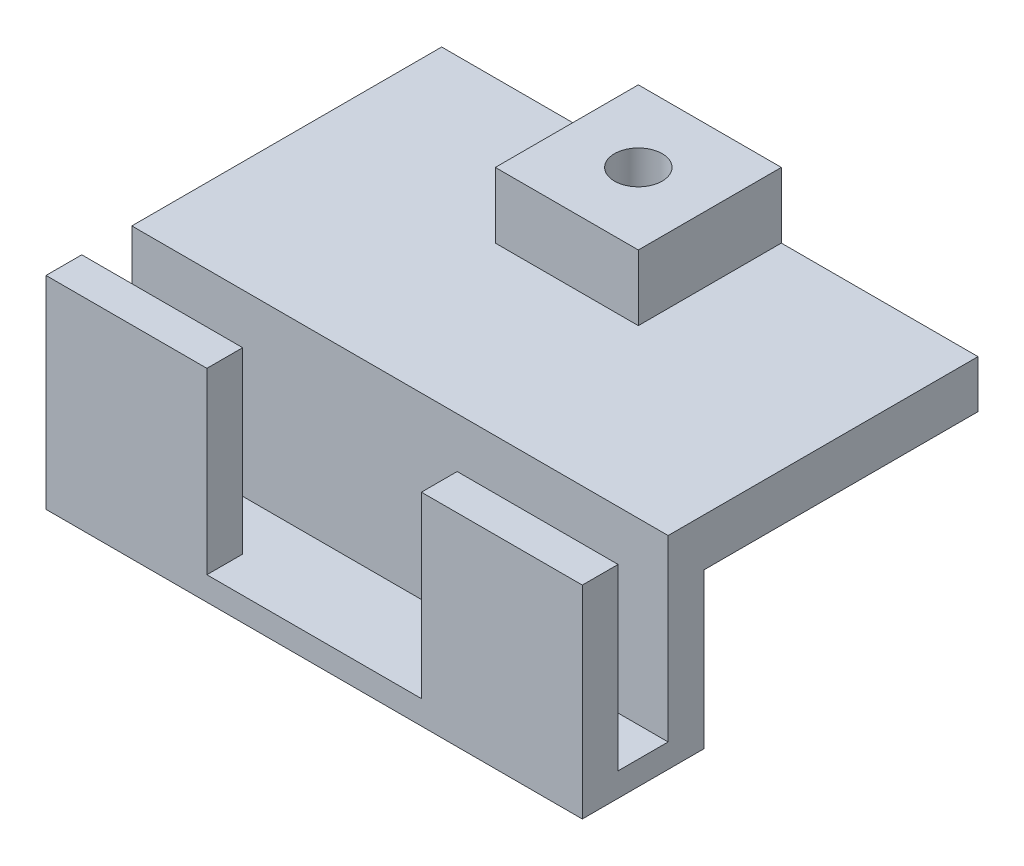
ISO-10303-21;
HEADER;
FILE_DESCRIPTION(('STEP AP214'),'2;1');
FILE_NAME('part.step','',(''),(''),'','','');
FILE_SCHEMA(('AUTOMOTIVE_DESIGN { 1 0 10303 214 1 1 1 1 }'));
ENDSEC;
DATA;
#1=APPLICATION_CONTEXT('core data for automotive mechanical design processes');
#2=APPLICATION_PROTOCOL_DEFINITION('international standard','automotive_design',2000,#1);
#3=PRODUCT_CONTEXT('',#1,'mechanical');
#4=PRODUCT('Part','Part','',(#3));
#5=PRODUCT_RELATED_PRODUCT_CATEGORY('part','',(#4));
#6=PRODUCT_DEFINITION_FORMATION('','',#4);
#7=PRODUCT_DEFINITION_CONTEXT('part definition',#1,'design');
#8=PRODUCT_DEFINITION('design','',#6,#7);
#9=PRODUCT_DEFINITION_SHAPE('','',#8);
#10=(LENGTH_UNIT() NAMED_UNIT(*) SI_UNIT(.MILLI.,.METRE.));
#11=(NAMED_UNIT(*) PLANE_ANGLE_UNIT() SI_UNIT($,.RADIAN.));
#12=(NAMED_UNIT(*) SI_UNIT($,.STERADIAN.) SOLID_ANGLE_UNIT());
#13=UNCERTAINTY_MEASURE_WITH_UNIT(LENGTH_MEASURE(1.E-05),#10,'distance_accuracy_value','');
#14=(GEOMETRIC_REPRESENTATION_CONTEXT(3) GLOBAL_UNCERTAINTY_ASSIGNED_CONTEXT((#13)) GLOBAL_UNIT_ASSIGNED_CONTEXT((#10,
#11,#12)) REPRESENTATION_CONTEXT('',''));
#15=CARTESIAN_POINT('',(0.,0.,0.));
#16=DIRECTION('',(0.,0.,1.));
#17=DIRECTION('',(1.,0.,0.));
#18=AXIS2_PLACEMENT_3D('',#15,#16,#17);
#19=CARTESIAN_POINT('',(0.,17.,0.));
#20=DIRECTION('',(0.,1.,0.));
#21=DIRECTION('',(0.,0.,1.));
#22=AXIS2_PLACEMENT_3D('',#19,#20,#21);
#23=PLANE('',#22);
#24=DIRECTION('',(1.,0.,0.));
#25=VECTOR('',#24,1.);
#26=CARTESIAN_POINT('',(22.5,17.,-28.1));
#27=LINE('',#26,#25);
#28=CARTESIAN_POINT('',(6.00000000000001,17.,-28.1));
#29=VERTEX_POINT('',#28);
#30=CARTESIAN_POINT('',(22.5,17.,-28.1));
#31=VERTEX_POINT('',#30);
#32=EDGE_CURVE('E200',#29,#31,#27,.T.);
#33=ORIENTED_EDGE('',*,*,#32,.F.);
#34=DIRECTION('',(0.,0.,-1.));
#35=VECTOR('',#34,1.);
#36=CARTESIAN_POINT('',(6.,17.,-16.1));
#37=LINE('',#36,#35);
#38=CARTESIAN_POINT('',(6.,17.,-16.1));
#39=VERTEX_POINT('',#38);
#40=EDGE_CURVE('E54',#39,#29,#37,.T.);
#41=ORIENTED_EDGE('',*,*,#40,.F.);
#42=DIRECTION('',(1.,0.,0.));
#43=VECTOR('',#42,1.);
#44=CARTESIAN_POINT('',(-6.,17.,-16.1));
#45=LINE('',#44,#43);
#46=CARTESIAN_POINT('',(-6.,17.,-16.1));
#47=VERTEX_POINT('',#46);
#48=EDGE_CURVE('E183',#47,#39,#45,.T.);
#49=ORIENTED_EDGE('',*,*,#48,.F.);
#50=DIRECTION('',(0.,0.,1.));
#51=VECTOR('',#50,1.);
#52=CARTESIAN_POINT('',(-6.,17.,-16.1));
#53=LINE('',#52,#51);
#54=CARTESIAN_POINT('',(-6.,17.,-28.1));
#55=VERTEX_POINT('',#54);
#56=EDGE_CURVE('E569',#55,#47,#53,.T.);
#57=ORIENTED_EDGE('',*,*,#56,.F.);
#58=CARTESIAN_POINT('',(-22.5,17.,-28.1));
#59=VERTEX_POINT('',#58);
#60=EDGE_CURVE('E201',#59,#55,#27,.T.);
#61=ORIENTED_EDGE('',*,*,#60,.F.);
#62=DIRECTION('',(0.,0.,1.));
#63=VECTOR('',#62,1.);
#64=CARTESIAN_POINT('',(-22.5,17.,-5.1));
#65=LINE('',#64,#63);
#66=CARTESIAN_POINT('',(-22.5,17.,-2.1));
#67=VERTEX_POINT('',#66);
#68=EDGE_CURVE('E210',#59,#67,#65,.T.);
#69=ORIENTED_EDGE('',*,*,#68,.T.);
#70=DIRECTION('',(1.,0.,0.));
#71=VECTOR('',#70,1.);
#72=CARTESIAN_POINT('',(-22.5,17.,-2.1));
#73=LINE('',#72,#71);
#74=CARTESIAN_POINT('',(22.5,17.,-2.1));
#75=VERTEX_POINT('',#74);
#76=EDGE_CURVE('E213',#67,#75,#73,.T.);
#77=ORIENTED_EDGE('',*,*,#76,.T.);
#78=DIRECTION('',(0.,0.,-1.));
#79=VECTOR('',#78,1.);
#80=CARTESIAN_POINT('',(22.5,17.,-5.1));
#81=LINE('',#80,#79);
#82=EDGE_CURVE('E216',#75,#31,#81,.T.);
#83=ORIENTED_EDGE('',*,*,#82,.T.);
#84=EDGE_LOOP('',(#33,#41,#49,#57,#61,#69,#77,#83));
#85=FACE_BOUND('',#84,.T.);
#86=ADVANCED_FACE('F39',(#85),#23,.T.);
#87=CARTESIAN_POINT('',(0.,2.,0.));
#88=DIRECTION('',(0.,-1.,0.));
#89=DIRECTION('',(0.,0.,-1.));
#90=AXIS2_PLACEMENT_3D('',#87,#88,#89);
#91=PLANE('',#90);
#92=DIRECTION('',(1.,0.,0.));
#93=VECTOR('',#92,1.);
#94=CARTESIAN_POINT('',(-22.5,2.,-2.1));
#95=LINE('',#94,#93);
#96=CARTESIAN_POINT('',(-22.5,2.,-2.1));
#97=VERTEX_POINT('',#96);
#98=CARTESIAN_POINT('',(22.5,2.,-2.1));
#99=VERTEX_POINT('',#98);
#100=EDGE_CURVE('E209',#97,#99,#95,.T.);
#101=ORIENTED_EDGE('',*,*,#100,.F.);
#102=DIRECTION('',(0.,0.,1.));
#103=VECTOR('',#102,1.);
#104=CARTESIAN_POINT('',(-22.5,2.,-5.1));
#105=LINE('',#104,#103);
#106=CARTESIAN_POINT('',(-22.5,2.,2.1));
#107=VERTEX_POINT('',#106);
#108=EDGE_CURVE('E285',#97,#107,#105,.T.);
#109=ORIENTED_EDGE('',*,*,#108,.T.);
#110=DIRECTION('',(-1.,0.,0.));
#111=VECTOR('',#110,1.);
#112=CARTESIAN_POINT('',(-22.5,2.,2.1));
#113=LINE('',#112,#111);
#114=CARTESIAN_POINT('',(-9.,2.,2.1));
#115=VERTEX_POINT('',#114);
#116=EDGE_CURVE('E259',#115,#107,#113,.T.);
#117=ORIENTED_EDGE('',*,*,#116,.F.);
#118=DIRECTION('',(0.,0.,-1.));
#119=VECTOR('',#118,1.);
#120=CARTESIAN_POINT('',(-9.,2.,5.1));
#121=LINE('',#120,#119);
#122=CARTESIAN_POINT('',(-9.,2.,5.1));
#123=VERTEX_POINT('',#122);
#124=EDGE_CURVE('E254',#123,#115,#121,.T.);
#125=ORIENTED_EDGE('',*,*,#124,.F.);
#126=DIRECTION('',(1.,0.,0.));
#127=VECTOR('',#126,1.);
#128=CARTESIAN_POINT('',(-22.5,2.,5.1));
#129=LINE('',#128,#127);
#130=CARTESIAN_POINT('',(9.,2.,5.1));
#131=VERTEX_POINT('',#130);
#132=EDGE_CURVE('E279',#123,#131,#129,.T.);
#133=ORIENTED_EDGE('',*,*,#132,.T.);
#134=DIRECTION('',(0.,0.,1.));
#135=VECTOR('',#134,1.);
#136=CARTESIAN_POINT('',(9.,2.,5.1));
#137=LINE('',#136,#135);
#138=CARTESIAN_POINT('',(9.,2.,2.1));
#139=VERTEX_POINT('',#138);
#140=EDGE_CURVE('E232',#139,#131,#137,.T.);
#141=ORIENTED_EDGE('',*,*,#140,.F.);
#142=DIRECTION('',(-1.,0.,0.));
#143=VECTOR('',#142,1.);
#144=CARTESIAN_POINT('',(22.5,2.,2.1));
#145=LINE('',#144,#143);
#146=CARTESIAN_POINT('',(22.5,2.,2.1));
#147=VERTEX_POINT('',#146);
#148=EDGE_CURVE('E227',#147,#139,#145,.T.);
#149=ORIENTED_EDGE('',*,*,#148,.F.);
#150=DIRECTION('',(0.,0.,1.));
#151=VECTOR('',#150,1.);
#152=CARTESIAN_POINT('',(22.5,2.,-5.1));
#153=LINE('',#152,#151);
#154=EDGE_CURVE('E282',#99,#147,#153,.T.);
#155=ORIENTED_EDGE('',*,*,#154,.F.);
#156=EDGE_LOOP('',(#101,#109,#117,#125,#133,#141,#149,#155));
#157=FACE_BOUND('',#156,.T.);
#158=ADVANCED_FACE('F329',(#157),#91,.F.);
#159=CARTESIAN_POINT('',(-22.5,2.,5.1));
#160=DIRECTION('',(0.,0.,-1.));
#161=DIRECTION('',(-1.,0.,0.));
#162=AXIS2_PLACEMENT_3D('',#159,#160,#161);
#163=PLANE('',#162);
#164=DIRECTION('',(1.,0.,0.));
#165=VECTOR('',#164,1.);
#166=CARTESIAN_POINT('',(-22.5,0.,5.1));
#167=LINE('',#166,#165);
#168=CARTESIAN_POINT('',(-22.5,0.,5.1));
#169=VERTEX_POINT('',#168);
#170=CARTESIAN_POINT('',(22.5,0.,5.1));
#171=VERTEX_POINT('',#170);
#172=EDGE_CURVE('E278',#169,#171,#167,.T.);
#173=ORIENTED_EDGE('',*,*,#172,.T.);
#174=DIRECTION('',(0.,-1.,0.));
#175=VECTOR('',#174,1.);
#176=CARTESIAN_POINT('',(22.5,2.,5.1));
#177=LINE('',#176,#175);
#178=CARTESIAN_POINT('',(22.5,17.,5.1));
#179=VERTEX_POINT('',#178);
#180=EDGE_CURVE('E11',#179,#171,#177,.T.);
#181=ORIENTED_EDGE('',*,*,#180,.F.);
#182=DIRECTION('',(1.,0.,0.));
#183=VECTOR('',#182,1.);
#184=CARTESIAN_POINT('',(22.5,17.,5.1));
#185=LINE('',#184,#183);
#186=CARTESIAN_POINT('',(9.,17.,5.1));
#187=VERTEX_POINT('',#186);
#188=EDGE_CURVE('E237',#187,#179,#185,.T.);
#189=ORIENTED_EDGE('',*,*,#188,.F.);
#190=DIRECTION('',(0.,-1.,0.));
#191=VECTOR('',#190,1.);
#192=CARTESIAN_POINT('',(9.,17.,5.1));
#193=LINE('',#192,#191);
#194=EDGE_CURVE('E241',#187,#131,#193,.T.);
#195=ORIENTED_EDGE('',*,*,#194,.T.);
#196=ORIENTED_EDGE('',*,*,#132,.F.);
#197=DIRECTION('',(0.,-1.,0.));
#198=VECTOR('',#197,1.);
#199=CARTESIAN_POINT('',(-9.,17.,5.1));
#200=LINE('',#199,#198);
#201=CARTESIAN_POINT('',(-9.,17.,5.1));
#202=VERTEX_POINT('',#201);
#203=EDGE_CURVE('E275',#202,#123,#200,.T.);
#204=ORIENTED_EDGE('',*,*,#203,.F.);
#205=DIRECTION('',(1.,0.,0.));
#206=VECTOR('',#205,1.);
#207=CARTESIAN_POINT('',(-22.5,17.,5.1));
#208=LINE('',#207,#206);
#209=CARTESIAN_POINT('',(-22.5,17.,5.1));
#210=VERTEX_POINT('',#209);
#211=EDGE_CURVE('E258',#210,#202,#208,.T.);
#212=ORIENTED_EDGE('',*,*,#211,.F.);
#213=DIRECTION('',(0.,-1.,0.));
#214=VECTOR('',#213,1.);
#215=CARTESIAN_POINT('',(-22.5,2.,5.1));
#216=LINE('',#215,#214);
#217=EDGE_CURVE('E287',#210,#169,#216,.T.);
#218=ORIENTED_EDGE('',*,*,#217,.T.);
#219=EDGE_LOOP('',(#173,#181,#189,#195,#196,#204,#212,#218));
#220=FACE_BOUND('',#219,.T.);
#221=ADVANCED_FACE('F41',(#220),#163,.F.);
#222=CARTESIAN_POINT('',(22.5,2.,-5.1));
#223=DIRECTION('',(1.,0.,0.));
#224=DIRECTION('',(0.,0.,-1.));
#225=AXIS2_PLACEMENT_3D('',#222,#223,#224);
#226=PLANE('',#225);
#227=DIRECTION('',(0.,0.,1.));
#228=VECTOR('',#227,1.);
#229=CARTESIAN_POINT('',(22.5,0.,-5.1));
#230=LINE('',#229,#228);
#231=CARTESIAN_POINT('',(22.5,0.,-5.1));
#232=VERTEX_POINT('',#231);
#233=EDGE_CURVE('E290',#232,#171,#230,.T.);
#234=ORIENTED_EDGE('',*,*,#233,.F.);
#235=DIRECTION('',(0.,-1.,0.));
#236=VECTOR('',#235,1.);
#237=CARTESIAN_POINT('',(22.5,2.,-5.1));
#238=LINE('',#237,#236);
#239=CARTESIAN_POINT('',(22.5,13.,-5.1));
#240=VERTEX_POINT('',#239);
#241=EDGE_CURVE('E47',#240,#232,#238,.T.);
#242=ORIENTED_EDGE('',*,*,#241,.F.);
#243=DIRECTION('',(0.,0.,1.));
#244=VECTOR('',#243,1.);
#245=CARTESIAN_POINT('',(22.5,13.,-28.1));
#246=LINE('',#245,#244);
#247=CARTESIAN_POINT('',(22.5,13.,-28.1));
#248=VERTEX_POINT('',#247);
#249=EDGE_CURVE('E206',#248,#240,#246,.T.);
#250=ORIENTED_EDGE('',*,*,#249,.F.);
#251=DIRECTION('',(0.,-1.,0.));
#252=VECTOR('',#251,1.);
#253=CARTESIAN_POINT('',(22.5,17.,-28.1));
#254=LINE('',#253,#252);
#255=EDGE_CURVE('E188',#31,#248,#254,.T.);
#256=ORIENTED_EDGE('',*,*,#255,.F.);
#257=ORIENTED_EDGE('',*,*,#82,.F.);
#258=DIRECTION('',(0.,-1.,0.));
#259=VECTOR('',#258,1.);
#260=CARTESIAN_POINT('',(22.5,17.,-2.1));
#261=LINE('',#260,#259);
#262=EDGE_CURVE('E219',#75,#99,#261,.T.);
#263=ORIENTED_EDGE('',*,*,#262,.T.);
#264=ORIENTED_EDGE('',*,*,#154,.T.);
#265=DIRECTION('',(0.,-1.,0.));
#266=VECTOR('',#265,1.);
#267=CARTESIAN_POINT('',(22.5,17.,2.1));
#268=LINE('',#267,#266);
#269=CARTESIAN_POINT('',(22.5,17.,2.1));
#270=VERTEX_POINT('',#269);
#271=EDGE_CURVE('E251',#270,#147,#268,.T.);
#272=ORIENTED_EDGE('',*,*,#271,.F.);
#273=DIRECTION('',(0.,0.,-1.));
#274=VECTOR('',#273,1.);
#275=CARTESIAN_POINT('',(22.5,17.,5.1));
#276=LINE('',#275,#274);
#277=EDGE_CURVE('E228',#179,#270,#276,.T.);
#278=ORIENTED_EDGE('',*,*,#277,.F.);
#279=ORIENTED_EDGE('',*,*,#180,.T.);
#280=EDGE_LOOP('',(#234,#242,#250,#256,#257,#263,#264,#272,#278,#279));
#281=FACE_BOUND('',#280,.T.);
#282=ADVANCED_FACE('F305',(#281),#226,.T.);
#283=CARTESIAN_POINT('',(-22.5,2.,-5.1));
#284=DIRECTION('',(0.,0.,-1.));
#285=DIRECTION('',(-1.,0.,0.));
#286=AXIS2_PLACEMENT_3D('',#283,#284,#285);
#287=PLANE('',#286);
#288=DIRECTION('',(-1.,0.,0.));
#289=VECTOR('',#288,1.);
#290=CARTESIAN_POINT('',(22.5,13.,-5.1));
#291=LINE('',#290,#289);
#292=CARTESIAN_POINT('',(-22.5,13.,-5.1));
#293=VERTEX_POINT('',#292);
#294=EDGE_CURVE('E62',#240,#293,#291,.T.);
#295=ORIENTED_EDGE('',*,*,#294,.F.);
#296=ORIENTED_EDGE('',*,*,#241,.T.);
#297=DIRECTION('',(1.,0.,0.));
#298=VECTOR('',#297,1.);
#299=CARTESIAN_POINT('',(-22.5,0.,-5.1));
#300=LINE('',#299,#298);
#301=CARTESIAN_POINT('',(-22.5,0.,-5.1));
#302=VERTEX_POINT('',#301);
#303=EDGE_CURVE('E293',#302,#232,#300,.T.);
#304=ORIENTED_EDGE('',*,*,#303,.F.);
#305=DIRECTION('',(0.,-1.,0.));
#306=VECTOR('',#305,1.);
#307=CARTESIAN_POINT('',(-22.5,2.,-5.1));
#308=LINE('',#307,#306);
#309=EDGE_CURVE('E299',#293,#302,#308,.T.);
#310=ORIENTED_EDGE('',*,*,#309,.F.);
#311=EDGE_LOOP('',(#295,#296,#304,#310));
#312=FACE_BOUND('',#311,.T.);
#313=ADVANCED_FACE('F302',(#312),#287,.T.);
#314=CARTESIAN_POINT('',(-22.5,2.,-5.1));
#315=DIRECTION('',(1.,0.,0.));
#316=DIRECTION('',(0.,0.,-1.));
#317=AXIS2_PLACEMENT_3D('',#314,#315,#316);
#318=PLANE('',#317);
#319=DIRECTION('',(0.,0.,1.));
#320=VECTOR('',#319,1.);
#321=CARTESIAN_POINT('',(-22.5,0.,-5.1));
#322=LINE('',#321,#320);
#323=EDGE_CURVE('E283',#302,#169,#322,.T.);
#324=ORIENTED_EDGE('',*,*,#323,.T.);
#325=ORIENTED_EDGE('',*,*,#217,.F.);
#326=DIRECTION('',(0.,0.,1.));
#327=VECTOR('',#326,1.);
#328=CARTESIAN_POINT('',(-22.5,17.,5.1));
#329=LINE('',#328,#327);
#330=CARTESIAN_POINT('',(-22.5,17.,2.1));
#331=VERTEX_POINT('',#330);
#332=EDGE_CURVE('E255',#331,#210,#329,.T.);
#333=ORIENTED_EDGE('',*,*,#332,.F.);
#334=DIRECTION('',(0.,-1.,0.));
#335=VECTOR('',#334,1.);
#336=CARTESIAN_POINT('',(-22.5,17.,2.1));
#337=LINE('',#336,#335);
#338=EDGE_CURVE('E265',#331,#107,#337,.T.);
#339=ORIENTED_EDGE('',*,*,#338,.T.);
#340=ORIENTED_EDGE('',*,*,#108,.F.);
#341=DIRECTION('',(0.,-1.,0.));
#342=VECTOR('',#341,1.);
#343=CARTESIAN_POINT('',(-22.5,17.,-2.1));
#344=LINE('',#343,#342);
#345=EDGE_CURVE('E224',#67,#97,#344,.T.);
#346=ORIENTED_EDGE('',*,*,#345,.F.);
#347=ORIENTED_EDGE('',*,*,#68,.F.);
#348=DIRECTION('',(0.,1.,0.));
#349=VECTOR('',#348,1.);
#350=CARTESIAN_POINT('',(-22.5,17.,-28.1));
#351=LINE('',#350,#349);
#352=CARTESIAN_POINT('',(-22.5,13.,-28.1));
#353=VERTEX_POINT('',#352);
#354=EDGE_CURVE('E197',#353,#59,#351,.T.);
#355=ORIENTED_EDGE('',*,*,#354,.F.);
#356=DIRECTION('',(0.,0.,1.));
#357=VECTOR('',#356,1.);
#358=CARTESIAN_POINT('',(-22.5,13.,-28.1));
#359=LINE('',#358,#357);
#360=EDGE_CURVE('E202',#353,#293,#359,.T.);
#361=ORIENTED_EDGE('',*,*,#360,.T.);
#362=ORIENTED_EDGE('',*,*,#309,.T.);
#363=EDGE_LOOP('',(#324,#325,#333,#339,#340,#346,#347,#355,#361,#362));
#364=FACE_BOUND('',#363,.T.);
#365=ADVANCED_FACE('F312',(#364),#318,.F.);
#366=CARTESIAN_POINT('',(0.,0.,0.));
#367=DIRECTION('',(0.,-1.,0.));
#368=DIRECTION('',(0.,0.,-1.));
#369=AXIS2_PLACEMENT_3D('',#366,#367,#368);
#370=PLANE('',#369);
#371=ORIENTED_EDGE('',*,*,#172,.F.);
#372=ORIENTED_EDGE('',*,*,#323,.F.);
#373=ORIENTED_EDGE('',*,*,#303,.T.);
#374=ORIENTED_EDGE('',*,*,#233,.T.);
#375=EDGE_LOOP('',(#371,#372,#373,#374));
#376=FACE_BOUND('',#375,.T.);
#377=ADVANCED_FACE('F310',(#376),#370,.T.);
#378=CARTESIAN_POINT('',(-9.,17.,5.1));
#379=DIRECTION('',(-1.,0.,0.));
#380=DIRECTION('',(0.,0.,1.));
#381=AXIS2_PLACEMENT_3D('',#378,#379,#380);
#382=PLANE('',#381);
#383=ORIENTED_EDGE('',*,*,#124,.T.);
#384=DIRECTION('',(0.,-1.,0.));
#385=VECTOR('',#384,1.);
#386=CARTESIAN_POINT('',(-9.,17.,2.1));
#387=LINE('',#386,#385);
#388=CARTESIAN_POINT('',(-9.,17.,2.1));
#389=VERTEX_POINT('',#388);
#390=EDGE_CURVE('E272',#389,#115,#387,.T.);
#391=ORIENTED_EDGE('',*,*,#390,.F.);
#392=DIRECTION('',(0.,0.,-1.));
#393=VECTOR('',#392,1.);
#394=CARTESIAN_POINT('',(-9.,17.,5.1));
#395=LINE('',#394,#393);
#396=EDGE_CURVE('E261',#202,#389,#395,.T.);
#397=ORIENTED_EDGE('',*,*,#396,.F.);
#398=ORIENTED_EDGE('',*,*,#203,.T.);
#399=EDGE_LOOP('',(#383,#391,#397,#398));
#400=FACE_BOUND('',#399,.T.);
#401=ADVANCED_FACE('F331',(#400),#382,.F.);
#402=CARTESIAN_POINT('',(-22.5,17.,2.1));
#403=DIRECTION('',(0.,0.,1.));
#404=DIRECTION('',(1.,0.,0.));
#405=AXIS2_PLACEMENT_3D('',#402,#403,#404);
#406=PLANE('',#405);
#407=ORIENTED_EDGE('',*,*,#116,.T.);
#408=ORIENTED_EDGE('',*,*,#338,.F.);
#409=DIRECTION('',(-1.,0.,0.));
#410=VECTOR('',#409,1.);
#411=CARTESIAN_POINT('',(-22.5,17.,2.1));
#412=LINE('',#411,#410);
#413=EDGE_CURVE('E263',#389,#331,#412,.T.);
#414=ORIENTED_EDGE('',*,*,#413,.F.);
#415=ORIENTED_EDGE('',*,*,#390,.T.);
#416=EDGE_LOOP('',(#407,#408,#414,#415));
#417=FACE_BOUND('',#416,.T.);
#418=ADVANCED_FACE('F326',(#417),#406,.F.);
#419=CARTESIAN_POINT('',(0.,17.,0.));
#420=DIRECTION('',(0.,-1.,0.));
#421=DIRECTION('',(0.,0.,-1.));
#422=AXIS2_PLACEMENT_3D('',#419,#420,#421);
#423=PLANE('',#422);
#424=ORIENTED_EDGE('',*,*,#332,.T.);
#425=ORIENTED_EDGE('',*,*,#211,.T.);
#426=ORIENTED_EDGE('',*,*,#396,.T.);
#427=ORIENTED_EDGE('',*,*,#413,.T.);
#428=EDGE_LOOP('',(#424,#425,#426,#427));
#429=FACE_BOUND('',#428,.T.);
#430=ADVANCED_FACE('F320',(#429),#423,.F.);
#431=CARTESIAN_POINT('',(22.5,17.,2.1));
#432=DIRECTION('',(0.,0.,1.));
#433=DIRECTION('',(1.,0.,0.));
#434=AXIS2_PLACEMENT_3D('',#431,#432,#433);
#435=PLANE('',#434);
#436=ORIENTED_EDGE('',*,*,#148,.T.);
#437=DIRECTION('',(0.,-1.,0.));
#438=VECTOR('',#437,1.);
#439=CARTESIAN_POINT('',(9.,17.,2.1));
#440=LINE('',#439,#438);
#441=CARTESIAN_POINT('',(9.,17.,2.1));
#442=VERTEX_POINT('',#441);
#443=EDGE_CURVE('E247',#442,#139,#440,.T.);
#444=ORIENTED_EDGE('',*,*,#443,.F.);
#445=DIRECTION('',(-1.,0.,0.));
#446=VECTOR('',#445,1.);
#447=CARTESIAN_POINT('',(22.5,17.,2.1));
#448=LINE('',#447,#446);
#449=EDGE_CURVE('E231',#270,#442,#448,.T.);
#450=ORIENTED_EDGE('',*,*,#449,.F.);
#451=ORIENTED_EDGE('',*,*,#271,.T.);
#452=EDGE_LOOP('',(#436,#444,#450,#451));
#453=FACE_BOUND('',#452,.T.);
#454=ADVANCED_FACE('F362',(#453),#435,.F.);
#455=CARTESIAN_POINT('',(9.,17.,5.1));
#456=DIRECTION('',(1.,0.,0.));
#457=DIRECTION('',(0.,0.,-1.));
#458=AXIS2_PLACEMENT_3D('',#455,#456,#457);
#459=PLANE('',#458);
#460=ORIENTED_EDGE('',*,*,#140,.T.);
#461=ORIENTED_EDGE('',*,*,#194,.F.);
#462=DIRECTION('',(0.,0.,1.));
#463=VECTOR('',#462,1.);
#464=CARTESIAN_POINT('',(9.,17.,5.1));
#465=LINE('',#464,#463);
#466=EDGE_CURVE('E234',#442,#187,#465,.T.);
#467=ORIENTED_EDGE('',*,*,#466,.F.);
#468=ORIENTED_EDGE('',*,*,#443,.T.);
#469=EDGE_LOOP('',(#460,#461,#467,#468));
#470=FACE_BOUND('',#469,.T.);
#471=ADVANCED_FACE('F358',(#470),#459,.F.);
#472=CARTESIAN_POINT('',(0.,17.,0.));
#473=DIRECTION('',(0.,1.,0.));
#474=DIRECTION('',(0.,0.,1.));
#475=AXIS2_PLACEMENT_3D('',#472,#473,#474);
#476=PLANE('',#475);
#477=ORIENTED_EDGE('',*,*,#277,.T.);
#478=ORIENTED_EDGE('',*,*,#449,.T.);
#479=ORIENTED_EDGE('',*,*,#466,.T.);
#480=ORIENTED_EDGE('',*,*,#188,.T.);
#481=EDGE_LOOP('',(#477,#478,#479,#480));
#482=FACE_BOUND('',#481,.T.);
#483=ADVANCED_FACE('F354',(#482),#476,.T.);
#484=CARTESIAN_POINT('',(-22.5,17.,-2.1));
#485=DIRECTION('',(0.,0.,-1.));
#486=DIRECTION('',(-1.,0.,0.));
#487=AXIS2_PLACEMENT_3D('',#484,#485,#486);
#488=PLANE('',#487);
#489=ORIENTED_EDGE('',*,*,#100,.T.);
#490=ORIENTED_EDGE('',*,*,#262,.F.);
#491=ORIENTED_EDGE('',*,*,#76,.F.);
#492=ORIENTED_EDGE('',*,*,#345,.T.);
#493=EDGE_LOOP('',(#489,#490,#491,#492));
#494=FACE_BOUND('',#493,.T.);
#495=ADVANCED_FACE('F351',(#494),#488,.F.);
#496=CARTESIAN_POINT('',(22.5,13.,-28.1));
#497=DIRECTION('',(0.,1.,0.));
#498=DIRECTION('',(0.,0.,1.));
#499=AXIS2_PLACEMENT_3D('',#496,#497,#498);
#500=PLANE('',#499);
#501=ORIENTED_EDGE('',*,*,#294,.T.);
#502=ORIENTED_EDGE('',*,*,#360,.F.);
#503=DIRECTION('',(-1.,0.,0.));
#504=VECTOR('',#503,1.);
#505=CARTESIAN_POINT('',(22.5,13.,-28.1));
#506=LINE('',#505,#504);
#507=EDGE_CURVE('E195',#248,#353,#506,.T.);
#508=ORIENTED_EDGE('',*,*,#507,.F.);
#509=ORIENTED_EDGE('',*,*,#249,.T.);
#510=EDGE_LOOP('',(#501,#502,#508,#509));
#511=FACE_BOUND('',#510,.T.);
#512=ADVANCED_FACE('F349',(#511),#500,.F.);
#513=CARTESIAN_POINT('',(0.,0.,-28.1));
#514=DIRECTION('',(0.,0.,-1.));
#515=DIRECTION('',(-1.,0.,0.));
#516=AXIS2_PLACEMENT_3D('',#513,#514,#515);
#517=PLANE('',#516);
#518=ORIENTED_EDGE('',*,*,#255,.T.);
#519=ORIENTED_EDGE('',*,*,#507,.T.);
#520=ORIENTED_EDGE('',*,*,#354,.T.);
#521=ORIENTED_EDGE('',*,*,#60,.T.);
#522=DIRECTION('',(0.,-1.,0.));
#523=VECTOR('',#522,1.);
#524=CARTESIAN_POINT('',(-6.,22.5,-28.1));
#525=LINE('',#524,#523);
#526=CARTESIAN_POINT('',(-6.,22.5,-28.1));
#527=VERTEX_POINT('',#526);
#528=EDGE_CURVE('E172',#527,#55,#525,.T.);
#529=ORIENTED_EDGE('',*,*,#528,.F.);
#530=DIRECTION('',(-1.,0.,0.));
#531=VECTOR('',#530,1.);
#532=CARTESIAN_POINT('',(-6.,22.5,-28.1));
#533=LINE('',#532,#531);
#534=CARTESIAN_POINT('',(6.,22.5,-28.1));
#535=VERTEX_POINT('',#534);
#536=EDGE_CURVE('E165',#535,#527,#533,.T.);
#537=ORIENTED_EDGE('',*,*,#536,.F.);
#538=DIRECTION('',(0.,-1.,0.));
#539=VECTOR('',#538,1.);
#540=CARTESIAN_POINT('',(6.,22.5,-28.1));
#541=LINE('',#540,#539);
#542=EDGE_CURVE('E169',#535,#29,#541,.T.);
#543=ORIENTED_EDGE('',*,*,#542,.T.);
#544=ORIENTED_EDGE('',*,*,#32,.T.);
#545=EDGE_LOOP('',(#518,#519,#520,#521,#529,#537,#543,#544));
#546=FACE_BOUND('',#545,.T.);
#547=ADVANCED_FACE('F168',(#546),#517,.T.);
#548=CARTESIAN_POINT('',(6.,22.5,-16.1));
#549=DIRECTION('',(-1.,0.,0.));
#550=DIRECTION('',(0.,0.,1.));
#551=AXIS2_PLACEMENT_3D('',#548,#549,#550);
#552=PLANE('',#551);
#553=ORIENTED_EDGE('',*,*,#40,.T.);
#554=ORIENTED_EDGE('',*,*,#542,.F.);
#555=DIRECTION('',(0.,0.,-1.));
#556=VECTOR('',#555,1.);
#557=CARTESIAN_POINT('',(6.,22.5,-16.1));
#558=LINE('',#557,#556);
#559=CARTESIAN_POINT('',(6.,22.5,-16.1));
#560=VERTEX_POINT('',#559);
#561=EDGE_CURVE('E176',#560,#535,#558,.T.);
#562=ORIENTED_EDGE('',*,*,#561,.F.);
#563=DIRECTION('',(0.,-1.,0.));
#564=VECTOR('',#563,1.);
#565=CARTESIAN_POINT('',(6.,22.5,-16.1));
#566=LINE('',#565,#564);
#567=EDGE_CURVE('E575',#560,#39,#566,.T.);
#568=ORIENTED_EDGE('',*,*,#567,.T.);
#569=EDGE_LOOP('',(#553,#554,#562,#568));
#570=FACE_BOUND('',#569,.T.);
#571=ADVANCED_FACE('F185',(#570),#552,.F.);
#572=CARTESIAN_POINT('',(-6.,22.5,-16.1));
#573=DIRECTION('',(1.,0.,0.));
#574=DIRECTION('',(0.,0.,-1.));
#575=AXIS2_PLACEMENT_3D('',#572,#573,#574);
#576=PLANE('',#575);
#577=ORIENTED_EDGE('',*,*,#56,.T.);
#578=DIRECTION('',(0.,-1.,0.));
#579=VECTOR('',#578,1.);
#580=CARTESIAN_POINT('',(-6.,22.5,-16.1));
#581=LINE('',#580,#579);
#582=CARTESIAN_POINT('',(-6.,22.5,-16.1));
#583=VERTEX_POINT('',#582);
#584=EDGE_CURVE('E190',#583,#47,#581,.T.);
#585=ORIENTED_EDGE('',*,*,#584,.F.);
#586=DIRECTION('',(0.,0.,1.));
#587=VECTOR('',#586,1.);
#588=CARTESIAN_POINT('',(-6.,22.5,-16.1));
#589=LINE('',#588,#587);
#590=EDGE_CURVE('E175',#527,#583,#589,.T.);
#591=ORIENTED_EDGE('',*,*,#590,.F.);
#592=ORIENTED_EDGE('',*,*,#528,.T.);
#593=EDGE_LOOP('',(#577,#585,#591,#592));
#594=FACE_BOUND('',#593,.T.);
#595=ADVANCED_FACE('F402',(#594),#576,.F.);
#596=CARTESIAN_POINT('',(-6.,22.5,-16.1));
#597=DIRECTION('',(0.,0.,-1.));
#598=DIRECTION('',(-1.,0.,0.));
#599=AXIS2_PLACEMENT_3D('',#596,#597,#598);
#600=PLANE('',#599);
#601=ORIENTED_EDGE('',*,*,#48,.T.);
#602=ORIENTED_EDGE('',*,*,#567,.F.);
#603=DIRECTION('',(1.,0.,0.));
#604=VECTOR('',#603,1.);
#605=CARTESIAN_POINT('',(-6.,22.5,-16.1));
#606=LINE('',#605,#604);
#607=EDGE_CURVE('E181',#583,#560,#606,.T.);
#608=ORIENTED_EDGE('',*,*,#607,.F.);
#609=ORIENTED_EDGE('',*,*,#584,.T.);
#610=EDGE_LOOP('',(#601,#602,#608,#609));
#611=FACE_BOUND('',#610,.T.);
#612=ADVANCED_FACE('F409',(#611),#600,.F.);
#613=CARTESIAN_POINT('',(0.,22.5,0.));
#614=DIRECTION('',(0.,-1.,0.));
#615=DIRECTION('',(0.,0.,-1.));
#616=AXIS2_PLACEMENT_3D('',#613,#614,#615);
#617=PLANE('',#616);
#618=CARTESIAN_POINT('',(0.,22.5,-22.1));
#619=DIRECTION('',(0.,1.,0.));
#620=DIRECTION('',(0.,0.,1.));
#621=AXIS2_PLACEMENT_3D('',#618,#619,#620);
#622=CIRCLE('',#621,2.);
#623=CARTESIAN_POINT('',(0.,22.5,-20.1));
#624=VERTEX_POINT('',#623);
#625=EDGE_CURVE('E567',#624,#624,#622,.T.);
#626=ORIENTED_EDGE('',*,*,#625,.F.);
#627=EDGE_LOOP('',(#626));
#628=FACE_BOUND('',#627,.T.);
#629=ORIENTED_EDGE('',*,*,#561,.T.);
#630=ORIENTED_EDGE('',*,*,#536,.T.);
#631=ORIENTED_EDGE('',*,*,#590,.T.);
#632=ORIENTED_EDGE('',*,*,#607,.T.);
#633=EDGE_LOOP('',(#629,#630,#631,#632));
#634=FACE_BOUND('',#633,.T.);
#635=ADVANCED_FACE('F179',(#628,#634),#617,.F.);
#636=CARTESIAN_POINT('',(0.,17.,-22.1));
#637=DIRECTION('',(0.,1.,0.));
#638=DIRECTION('',(0.,0.,1.));
#639=AXIS2_PLACEMENT_3D('',#636,#637,#638);
#640=CYLINDRICAL_SURFACE('',#639,2.);
#641=CARTESIAN_POINT('',(0.,17.,-22.1));
#642=DIRECTION('',(0.,1.,0.));
#643=DIRECTION('',(0.,0.,1.));
#644=AXIS2_PLACEMENT_3D('',#641,#642,#643);
#645=CIRCLE('',#644,2.);
#646=CARTESIAN_POINT('',(0.,17.,-20.1));
#647=VERTEX_POINT('',#646);
#648=EDGE_CURVE('E566',#647,#647,#645,.T.);
#649=ORIENTED_EDGE('',*,*,#648,.F.);
#650=EDGE_LOOP('',(#649));
#651=FACE_BOUND('',#650,.T.);
#652=ORIENTED_EDGE('',*,*,#625,.T.);
#653=EDGE_LOOP('',(#652));
#654=FACE_BOUND('',#653,.T.);
#655=ADVANCED_FACE('F424',(#651,#654),#640,.F.);
#656=CARTESIAN_POINT('',(0.,17.,-22.1));
#657=DIRECTION('',(0.,1.,0.));
#658=DIRECTION('',(0.,0.,1.));
#659=AXIS2_PLACEMENT_3D('',#656,#657,#658);
#660=PLANE('',#659);
#661=ORIENTED_EDGE('',*,*,#648,.T.);
#662=EDGE_LOOP('',(#661));
#663=FACE_BOUND('',#662,.T.);
#664=ADVANCED_FACE('F432',(#663),#660,.T.);
#665=CLOSED_SHELL('',(#86,#158,#221,#282,#313,#365,#377,#401,#418,#430,#454,#471,#483,#495,#512,
#547,#571,#595,#612,#635,#655,#664));
#666=MANIFOLD_SOLID_BREP('B2',#665);
#667=ADVANCED_BREP_SHAPE_REPRESENTATION('',(#18,#666),#14);
#668=SHAPE_DEFINITION_REPRESENTATION(#9,#667);
ENDSEC;
END-ISO-10303-21;
